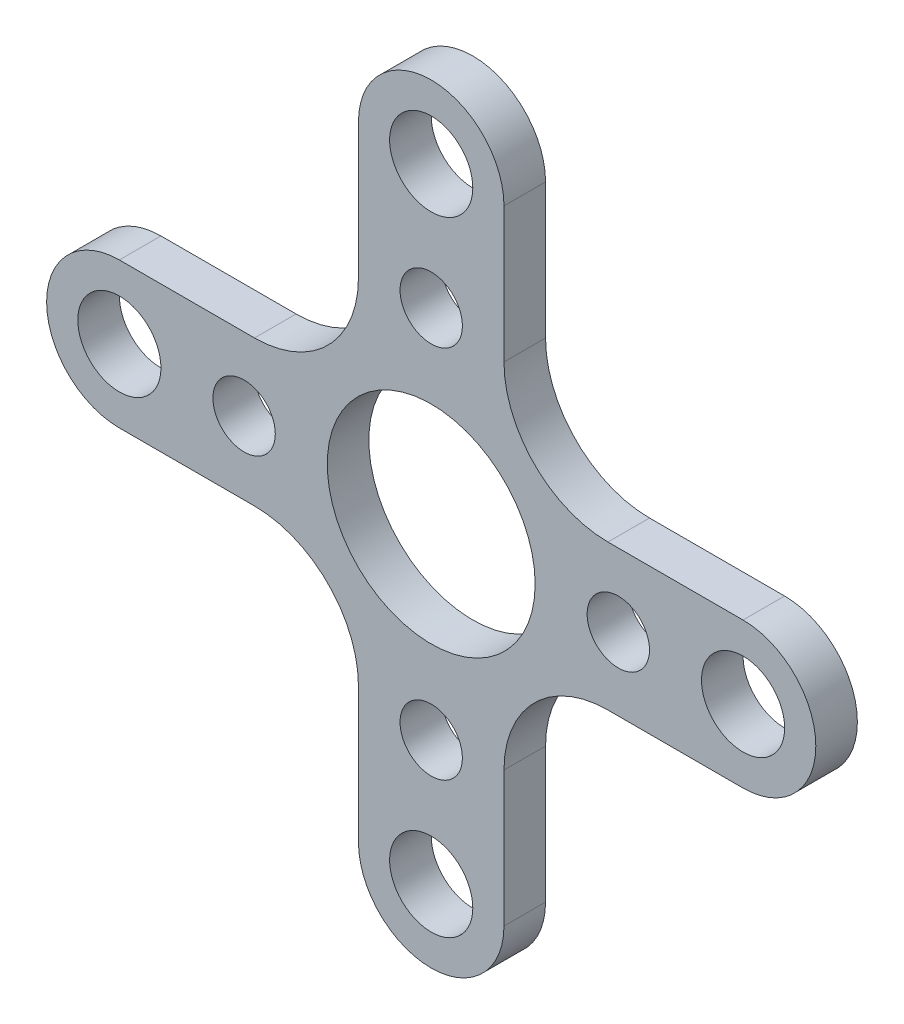
ISO-10303-21;
HEADER;
FILE_DESCRIPTION(('STEP AP214'),'2;1');
FILE_NAME('part.step','',(''),(''),'','','');
FILE_SCHEMA(('AUTOMOTIVE_DESIGN { 1 0 10303 214 1 1 1 1 }'));
ENDSEC;
DATA;
#1=APPLICATION_CONTEXT('core data for automotive mechanical design processes');
#2=APPLICATION_PROTOCOL_DEFINITION('international standard','automotive_design',2000,#1);
#3=PRODUCT_CONTEXT('',#1,'mechanical');
#4=PRODUCT('Part','Part','',(#3));
#5=PRODUCT_RELATED_PRODUCT_CATEGORY('part','',(#4));
#6=PRODUCT_DEFINITION_FORMATION('','',#4);
#7=PRODUCT_DEFINITION_CONTEXT('part definition',#1,'design');
#8=PRODUCT_DEFINITION('design','',#6,#7);
#9=PRODUCT_DEFINITION_SHAPE('','',#8);
#10=(LENGTH_UNIT() NAMED_UNIT(*) SI_UNIT(.MILLI.,.METRE.));
#11=(NAMED_UNIT(*) PLANE_ANGLE_UNIT() SI_UNIT($,.RADIAN.));
#12=(NAMED_UNIT(*) SI_UNIT($,.STERADIAN.) SOLID_ANGLE_UNIT());
#13=UNCERTAINTY_MEASURE_WITH_UNIT(LENGTH_MEASURE(1.E-05),#10,'distance_accuracy_value','');
#14=(GEOMETRIC_REPRESENTATION_CONTEXT(3) GLOBAL_UNCERTAINTY_ASSIGNED_CONTEXT((#13)) GLOBAL_UNIT_ASSIGNED_CONTEXT((#10,
#11,#12)) REPRESENTATION_CONTEXT('',''));
#15=CARTESIAN_POINT('',(0.,0.,0.));
#16=DIRECTION('',(0.,0.,1.));
#17=DIRECTION('',(1.,0.,0.));
#18=AXIS2_PLACEMENT_3D('',#15,#16,#17);
#19=CARTESIAN_POINT('',(29.9999999999999,10.5000000000001,2.));
#20=DIRECTION('',(0.,0.,-1.));
#21=DIRECTION('',(-1.,0.,0.));
#22=AXIS2_PLACEMENT_3D('',#19,#20,#21);
#23=PLANE('',#22);
#24=CARTESIAN_POINT('',(21.4999999999999,-6.99999999999996,2.));
#25=DIRECTION('',(0.,0.,1.));
#26=DIRECTION('',(1.,0.,0.));
#27=AXIS2_PLACEMENT_3D('',#24,#25,#26);
#28=CIRCLE('',#27,1.5);
#29=CARTESIAN_POINT('',(22.9999999999999,-6.99999999999996,2.));
#30=VERTEX_POINT('',#29);
#31=EDGE_CURVE('E364',#30,#30,#28,.T.);
#32=ORIENTED_EDGE('',*,*,#31,.F.);
#33=EDGE_LOOP('',(#32));
#34=FACE_BOUND('',#33,.T.);
#35=CARTESIAN_POINT('',(30.5,1.99999999999995,2.));
#36=DIRECTION('',(0.,0.,1.));
#37=DIRECTION('',(1.,0.,0.));
#38=AXIS2_PLACEMENT_3D('',#35,#36,#37);
#39=CIRCLE('',#38,1.5);
#40=CARTESIAN_POINT('',(32.,1.99999999999995,2.));
#41=VERTEX_POINT('',#40);
#42=EDGE_CURVE('E376',#41,#41,#39,.T.);
#43=ORIENTED_EDGE('',*,*,#42,.F.);
#44=EDGE_LOOP('',(#43));
#45=FACE_BOUND('',#44,.T.);
#46=CARTESIAN_POINT('',(21.5,11.,2.));
#47=DIRECTION('',(0.,0.,1.));
#48=DIRECTION('',(1.,0.,0.));
#49=AXIS2_PLACEMENT_3D('',#46,#47,#48);
#50=CIRCLE('',#49,1.5);
#51=CARTESIAN_POINT('',(23.,11.,2.));
#52=VERTEX_POINT('',#51);
#53=EDGE_CURVE('E388',#52,#52,#50,.T.);
#54=ORIENTED_EDGE('',*,*,#53,.F.);
#55=EDGE_LOOP('',(#54));
#56=FACE_BOUND('',#55,.T.);
#57=CARTESIAN_POINT('',(12.5,2.00000000000012,2.));
#58=DIRECTION('',(0.,0.,1.));
#59=DIRECTION('',(1.,0.,0.));
#60=AXIS2_PLACEMENT_3D('',#57,#58,#59);
#61=CIRCLE('',#60,1.5);
#62=CARTESIAN_POINT('',(14.,2.00000000000012,2.));
#63=VERTEX_POINT('',#62);
#64=EDGE_CURVE('E400',#63,#63,#61,.T.);
#65=ORIENTED_EDGE('',*,*,#64,.F.);
#66=EDGE_LOOP('',(#65));
#67=FACE_BOUND('',#66,.T.);
#68=CARTESIAN_POINT('',(29.9999999999999,10.5000000000001,2.));
#69=DIRECTION('',(0.,0.,-1.));
#70=DIRECTION('',(-1.,0.,0.));
#71=AXIS2_PLACEMENT_3D('',#68,#69,#70);
#72=CIRCLE('',#71,5.);
#73=CARTESIAN_POINT('',(29.9999999999999,5.50000000000011,2.));
#74=VERTEX_POINT('',#73);
#75=CARTESIAN_POINT('',(24.9999999999999,10.5000000000001,2.));
#76=VERTEX_POINT('',#75);
#77=EDGE_CURVE('E209',#74,#76,#72,.T.);
#78=ORIENTED_EDGE('',*,*,#77,.T.);
#79=DIRECTION('',(0.,1.,0.));
#80=VECTOR('',#79,1.);
#81=CARTESIAN_POINT('',(24.9999999999999,17.,2.));
#82=LINE('',#81,#80);
#83=CARTESIAN_POINT('',(24.9999999999999,17.,2.));
#84=VERTEX_POINT('',#83);
#85=EDGE_CURVE('E117',#76,#84,#82,.T.);
#86=ORIENTED_EDGE('',*,*,#85,.T.);
#87=CARTESIAN_POINT('',(21.4999999999999,17.,2.));
#88=DIRECTION('',(0.,0.,1.));
#89=DIRECTION('',(-1.,0.,0.));
#90=AXIS2_PLACEMENT_3D('',#87,#88,#89);
#91=CIRCLE('',#90,3.5);
#92=CARTESIAN_POINT('',(17.9999999999999,17.,2.));
#93=VERTEX_POINT('',#92);
#94=EDGE_CURVE('E248',#84,#93,#91,.T.);
#95=ORIENTED_EDGE('',*,*,#94,.T.);
#96=DIRECTION('',(0.,-1.,0.));
#97=VECTOR('',#96,1.);
#98=CARTESIAN_POINT('',(17.9999999999999,17.,2.));
#99=LINE('',#98,#97);
#100=CARTESIAN_POINT('',(17.9999999999999,10.5000000000001,2.));
#101=VERTEX_POINT('',#100);
#102=EDGE_CURVE('E267',#93,#101,#99,.T.);
#103=ORIENTED_EDGE('',*,*,#102,.T.);
#104=CARTESIAN_POINT('',(12.9999999999999,10.5000000000001,2.));
#105=DIRECTION('',(0.,0.,-1.));
#106=DIRECTION('',(-1.,0.,0.));
#107=AXIS2_PLACEMENT_3D('',#104,#105,#106);
#108=CIRCLE('',#107,5.);
#109=CARTESIAN_POINT('',(12.9999999999999,5.50000000000011,2.));
#110=VERTEX_POINT('',#109);
#111=EDGE_CURVE('E264',#101,#110,#108,.T.);
#112=ORIENTED_EDGE('',*,*,#111,.T.);
#113=DIRECTION('',(-1.,0.,0.));
#114=VECTOR('',#113,1.);
#115=CARTESIAN_POINT('',(6.49999999999996,5.50000000000011,2.));
#116=LINE('',#115,#114);
#117=CARTESIAN_POINT('',(6.49999999999996,5.50000000000011,2.));
#118=VERTEX_POINT('',#117);
#119=EDGE_CURVE('E266',#110,#118,#116,.T.);
#120=ORIENTED_EDGE('',*,*,#119,.T.);
#121=CARTESIAN_POINT('',(6.49999999999996,2.00000000000011,2.));
#122=DIRECTION('',(0.,0.,1.));
#123=DIRECTION('',(-1.,0.,0.));
#124=AXIS2_PLACEMENT_3D('',#121,#122,#123);
#125=CIRCLE('',#124,3.5);
#126=CARTESIAN_POINT('',(6.49999999999996,-1.49999999999989,2.));
#127=VERTEX_POINT('',#126);
#128=EDGE_CURVE('E269',#118,#127,#125,.T.);
#129=ORIENTED_EDGE('',*,*,#128,.T.);
#130=DIRECTION('',(1.,0.,0.));
#131=VECTOR('',#130,1.);
#132=CARTESIAN_POINT('',(6.49999999999996,-1.49999999999989,2.));
#133=LINE('',#132,#131);
#134=CARTESIAN_POINT('',(12.9999999999999,-1.49999999999989,2.));
#135=VERTEX_POINT('',#134);
#136=EDGE_CURVE('E275',#127,#135,#133,.T.);
#137=ORIENTED_EDGE('',*,*,#136,.T.);
#138=CARTESIAN_POINT('',(12.9999999999999,-6.49999999999989,2.));
#139=DIRECTION('',(0.,0.,-1.));
#140=DIRECTION('',(1.,0.,0.));
#141=AXIS2_PLACEMENT_3D('',#138,#139,#140);
#142=CIRCLE('',#141,5.);
#143=CARTESIAN_POINT('',(17.9999999999999,-6.49999999999989,2.));
#144=VERTEX_POINT('',#143);
#145=EDGE_CURVE('E277',#135,#144,#142,.T.);
#146=ORIENTED_EDGE('',*,*,#145,.T.);
#147=DIRECTION('',(0.,-1.,0.));
#148=VECTOR('',#147,1.);
#149=CARTESIAN_POINT('',(17.9999999999999,-6.49999999999989,2.));
#150=LINE('',#149,#148);
#151=CARTESIAN_POINT('',(17.9999999999999,-12.9999999999998,2.));
#152=VERTEX_POINT('',#151);
#153=EDGE_CURVE('E279',#144,#152,#150,.T.);
#154=ORIENTED_EDGE('',*,*,#153,.T.);
#155=CARTESIAN_POINT('',(21.4999999999999,-12.9999999999998,2.));
#156=DIRECTION('',(0.,0.,1.));
#157=DIRECTION('',(-1.,0.,0.));
#158=AXIS2_PLACEMENT_3D('',#155,#156,#157);
#159=CIRCLE('',#158,3.5);
#160=CARTESIAN_POINT('',(24.9999999999999,-12.9999999999998,2.));
#161=VERTEX_POINT('',#160);
#162=EDGE_CURVE('E281',#152,#161,#159,.T.);
#163=ORIENTED_EDGE('',*,*,#162,.T.);
#164=DIRECTION('',(0.,1.,0.));
#165=VECTOR('',#164,1.);
#166=CARTESIAN_POINT('',(24.9999999999999,-6.49999999999989,2.));
#167=LINE('',#166,#165);
#168=CARTESIAN_POINT('',(24.9999999999999,-6.49999999999989,2.));
#169=VERTEX_POINT('',#168);
#170=EDGE_CURVE('E283',#161,#169,#167,.T.);
#171=ORIENTED_EDGE('',*,*,#170,.T.);
#172=CARTESIAN_POINT('',(29.9999999999999,-6.49999999999989,2.));
#173=DIRECTION('',(0.,0.,-1.));
#174=DIRECTION('',(-1.,0.,0.));
#175=AXIS2_PLACEMENT_3D('',#172,#173,#174);
#176=CIRCLE('',#175,5.);
#177=CARTESIAN_POINT('',(29.9999999999999,-1.49999999999989,2.));
#178=VERTEX_POINT('',#177);
#179=EDGE_CURVE('E160',#169,#178,#176,.T.);
#180=ORIENTED_EDGE('',*,*,#179,.T.);
#181=DIRECTION('',(1.,0.,0.));
#182=VECTOR('',#181,1.);
#183=CARTESIAN_POINT('',(29.9999999999999,-1.49999999999989,2.));
#184=LINE('',#183,#182);
#185=CARTESIAN_POINT('',(36.4999999999998,-1.49999999999988,2.));
#186=VERTEX_POINT('',#185);
#187=EDGE_CURVE('E154',#178,#186,#184,.T.);
#188=ORIENTED_EDGE('',*,*,#187,.T.);
#189=CARTESIAN_POINT('',(36.4999999999998,2.00000000000012,2.));
#190=DIRECTION('',(0.,0.,1.));
#191=DIRECTION('',(-1.,0.,0.));
#192=AXIS2_PLACEMENT_3D('',#189,#190,#191);
#193=CIRCLE('',#192,3.5);
#194=CARTESIAN_POINT('',(36.4999999999998,5.50000000000011,2.));
#195=VERTEX_POINT('',#194);
#196=EDGE_CURVE('E158',#186,#195,#193,.T.);
#197=ORIENTED_EDGE('',*,*,#196,.T.);
#198=DIRECTION('',(-1.,0.,0.));
#199=VECTOR('',#198,1.);
#200=CARTESIAN_POINT('',(29.9999999999999,5.50000000000011,2.));
#201=LINE('',#200,#199);
#202=EDGE_CURVE('E50',#195,#74,#201,.T.);
#203=ORIENTED_EDGE('',*,*,#202,.T.);
#204=EDGE_LOOP('',(#78,#86,#95,#103,#112,#120,#129,#137,#146,#154,#163,#171,#180,#188,#197,#203));
#205=FACE_BOUND('',#204,.T.);
#206=CARTESIAN_POINT('',(21.4999999999999,2.00000000000011,2.));
#207=DIRECTION('',(0.,0.,1.));
#208=DIRECTION('',(1.,0.,0.));
#209=AXIS2_PLACEMENT_3D('',#206,#207,#208);
#210=CIRCLE('',#209,5.);
#211=CARTESIAN_POINT('',(26.4999999999999,2.00000000000011,2.));
#212=VERTEX_POINT('',#211);
#213=EDGE_CURVE('E182',#212,#212,#210,.T.);
#214=ORIENTED_EDGE('',*,*,#213,.F.);
#215=EDGE_LOOP('',(#214));
#216=FACE_BOUND('',#215,.T.);
#217=CARTESIAN_POINT('',(6.49999999999996,2.00000000000011,2.));
#218=DIRECTION('',(0.,0.,1.));
#219=DIRECTION('',(1.,0.,0.));
#220=AXIS2_PLACEMENT_3D('',#217,#218,#219);
#221=CIRCLE('',#220,2.);
#222=CARTESIAN_POINT('',(8.49999999999996,2.00000000000011,2.));
#223=VERTEX_POINT('',#222);
#224=EDGE_CURVE('E394',#223,#223,#221,.T.);
#225=ORIENTED_EDGE('',*,*,#224,.F.);
#226=EDGE_LOOP('',(#225));
#227=FACE_BOUND('',#226,.T.);
#228=CARTESIAN_POINT('',(21.5,17.,2.));
#229=DIRECTION('',(0.,0.,1.));
#230=DIRECTION('',(1.,0.,0.));
#231=AXIS2_PLACEMENT_3D('',#228,#229,#230);
#232=CIRCLE('',#231,2.);
#233=CARTESIAN_POINT('',(23.5,17.,2.));
#234=VERTEX_POINT('',#233);
#235=EDGE_CURVE('E382',#234,#234,#232,.T.);
#236=ORIENTED_EDGE('',*,*,#235,.F.);
#237=EDGE_LOOP('',(#236));
#238=FACE_BOUND('',#237,.T.);
#239=CARTESIAN_POINT('',(36.5,1.99999999999996,2.));
#240=DIRECTION('',(0.,0.,1.));
#241=DIRECTION('',(1.,0.,0.));
#242=AXIS2_PLACEMENT_3D('',#239,#240,#241);
#243=CIRCLE('',#242,2.);
#244=CARTESIAN_POINT('',(38.5,1.99999999999996,2.));
#245=VERTEX_POINT('',#244);
#246=EDGE_CURVE('E370',#245,#245,#243,.T.);
#247=ORIENTED_EDGE('',*,*,#246,.F.);
#248=EDGE_LOOP('',(#247));
#249=FACE_BOUND('',#248,.T.);
#250=CARTESIAN_POINT('',(21.4999999999999,-13.,2.));
#251=DIRECTION('',(0.,0.,1.));
#252=DIRECTION('',(1.,0.,0.));
#253=AXIS2_PLACEMENT_3D('',#250,#251,#252);
#254=CIRCLE('',#253,2.);
#255=CARTESIAN_POINT('',(23.4999999999999,-13.,2.));
#256=VERTEX_POINT('',#255);
#257=EDGE_CURVE('E355',#256,#256,#254,.T.);
#258=ORIENTED_EDGE('',*,*,#257,.F.);
#259=EDGE_LOOP('',(#258));
#260=FACE_BOUND('',#259,.T.);
#261=ADVANCED_FACE('F33',(#34,#45,#56,#67,#205,#216,#227,#238,#249,#260),#23,.F.);
#262=CARTESIAN_POINT('',(29.9999999999999,10.5000000000001,0.));
#263=DIRECTION('',(0.,0.,-1.));
#264=DIRECTION('',(-1.,0.,0.));
#265=AXIS2_PLACEMENT_3D('',#262,#263,#264);
#266=PLANE('',#265);
#267=CARTESIAN_POINT('',(21.4999999999999,-6.99999999999996,0.));
#268=DIRECTION('',(0.,0.,1.));
#269=DIRECTION('',(1.,0.,0.));
#270=AXIS2_PLACEMENT_3D('',#267,#268,#269);
#271=CIRCLE('',#270,1.5);
#272=CARTESIAN_POINT('',(22.9999999999999,-6.99999999999996,0.));
#273=VERTEX_POINT('',#272);
#274=EDGE_CURVE('E361',#273,#273,#271,.T.);
#275=ORIENTED_EDGE('',*,*,#274,.T.);
#276=EDGE_LOOP('',(#275));
#277=FACE_BOUND('',#276,.T.);
#278=CARTESIAN_POINT('',(30.5,1.99999999999995,0.));
#279=DIRECTION('',(0.,0.,1.));
#280=DIRECTION('',(1.,0.,0.));
#281=AXIS2_PLACEMENT_3D('',#278,#279,#280);
#282=CIRCLE('',#281,1.5);
#283=CARTESIAN_POINT('',(32.,1.99999999999995,0.));
#284=VERTEX_POINT('',#283);
#285=EDGE_CURVE('E373',#284,#284,#282,.T.);
#286=ORIENTED_EDGE('',*,*,#285,.T.);
#287=EDGE_LOOP('',(#286));
#288=FACE_BOUND('',#287,.T.);
#289=CARTESIAN_POINT('',(21.5,11.,0.));
#290=DIRECTION('',(0.,0.,1.));
#291=DIRECTION('',(1.,0.,0.));
#292=AXIS2_PLACEMENT_3D('',#289,#290,#291);
#293=CIRCLE('',#292,1.5);
#294=CARTESIAN_POINT('',(23.,11.,0.));
#295=VERTEX_POINT('',#294);
#296=EDGE_CURVE('E385',#295,#295,#293,.T.);
#297=ORIENTED_EDGE('',*,*,#296,.T.);
#298=EDGE_LOOP('',(#297));
#299=FACE_BOUND('',#298,.T.);
#300=CARTESIAN_POINT('',(12.5,2.00000000000012,0.));
#301=DIRECTION('',(0.,0.,1.));
#302=DIRECTION('',(1.,0.,0.));
#303=AXIS2_PLACEMENT_3D('',#300,#301,#302);
#304=CIRCLE('',#303,1.5);
#305=CARTESIAN_POINT('',(14.,2.00000000000012,0.));
#306=VERTEX_POINT('',#305);
#307=EDGE_CURVE('E397',#306,#306,#304,.T.);
#308=ORIENTED_EDGE('',*,*,#307,.T.);
#309=EDGE_LOOP('',(#308));
#310=FACE_BOUND('',#309,.T.);
#311=CARTESIAN_POINT('',(29.9999999999999,10.5000000000001,0.));
#312=DIRECTION('',(0.,0.,-1.));
#313=DIRECTION('',(-1.,0.,0.));
#314=AXIS2_PLACEMENT_3D('',#311,#312,#313);
#315=CIRCLE('',#314,5.);
#316=CARTESIAN_POINT('',(29.9999999999999,5.50000000000011,0.));
#317=VERTEX_POINT('',#316);
#318=CARTESIAN_POINT('',(24.9999999999999,10.5000000000001,0.));
#319=VERTEX_POINT('',#318);
#320=EDGE_CURVE('E178',#317,#319,#315,.T.);
#321=ORIENTED_EDGE('',*,*,#320,.F.);
#322=DIRECTION('',(-1.,0.,0.));
#323=VECTOR('',#322,1.);
#324=CARTESIAN_POINT('',(29.9999999999999,5.50000000000011,0.));
#325=LINE('',#324,#323);
#326=CARTESIAN_POINT('',(36.4999999999998,5.50000000000011,0.));
#327=VERTEX_POINT('',#326);
#328=EDGE_CURVE('E109',#327,#317,#325,.T.);
#329=ORIENTED_EDGE('',*,*,#328,.F.);
#330=CARTESIAN_POINT('',(36.4999999999998,2.00000000000012,0.));
#331=DIRECTION('',(0.,0.,1.));
#332=DIRECTION('',(-1.,0.,0.));
#333=AXIS2_PLACEMENT_3D('',#330,#331,#332);
#334=CIRCLE('',#333,3.5);
#335=CARTESIAN_POINT('',(36.4999999999998,-1.49999999999988,0.));
#336=VERTEX_POINT('',#335);
#337=EDGE_CURVE('E103',#336,#327,#334,.T.);
#338=ORIENTED_EDGE('',*,*,#337,.F.);
#339=DIRECTION('',(1.,0.,0.));
#340=VECTOR('',#339,1.);
#341=CARTESIAN_POINT('',(29.9999999999999,-1.49999999999989,0.));
#342=LINE('',#341,#340);
#343=CARTESIAN_POINT('',(29.9999999999999,-1.49999999999989,0.));
#344=VERTEX_POINT('',#343);
#345=EDGE_CURVE('E168',#344,#336,#342,.T.);
#346=ORIENTED_EDGE('',*,*,#345,.F.);
#347=CARTESIAN_POINT('',(29.9999999999999,-6.49999999999989,0.));
#348=DIRECTION('',(0.,0.,-1.));
#349=DIRECTION('',(-1.,0.,0.));
#350=AXIS2_PLACEMENT_3D('',#347,#348,#349);
#351=CIRCLE('',#350,5.);
#352=CARTESIAN_POINT('',(24.9999999999999,-6.49999999999989,0.));
#353=VERTEX_POINT('',#352);
#354=EDGE_CURVE('E204',#353,#344,#351,.T.);
#355=ORIENTED_EDGE('',*,*,#354,.F.);
#356=DIRECTION('',(0.,1.,0.));
#357=VECTOR('',#356,1.);
#358=CARTESIAN_POINT('',(24.9999999999999,-6.49999999999989,0.));
#359=LINE('',#358,#357);
#360=CARTESIAN_POINT('',(24.9999999999999,-12.9999999999998,0.));
#361=VERTEX_POINT('',#360);
#362=EDGE_CURVE('E202',#361,#353,#359,.T.);
#363=ORIENTED_EDGE('',*,*,#362,.F.);
#364=CARTESIAN_POINT('',(21.4999999999999,-12.9999999999998,0.));
#365=DIRECTION('',(0.,0.,1.));
#366=DIRECTION('',(-1.,0.,0.));
#367=AXIS2_PLACEMENT_3D('',#364,#365,#366);
#368=CIRCLE('',#367,3.5);
#369=CARTESIAN_POINT('',(17.9999999999999,-12.9999999999998,0.));
#370=VERTEX_POINT('',#369);
#371=EDGE_CURVE('E200',#370,#361,#368,.T.);
#372=ORIENTED_EDGE('',*,*,#371,.F.);
#373=DIRECTION('',(0.,-1.,0.));
#374=VECTOR('',#373,1.);
#375=CARTESIAN_POINT('',(17.9999999999999,-6.49999999999989,0.));
#376=LINE('',#375,#374);
#377=CARTESIAN_POINT('',(17.9999999999999,-6.49999999999989,0.));
#378=VERTEX_POINT('',#377);
#379=EDGE_CURVE('E198',#378,#370,#376,.T.);
#380=ORIENTED_EDGE('',*,*,#379,.F.);
#381=CARTESIAN_POINT('',(12.9999999999999,-6.49999999999989,0.));
#382=DIRECTION('',(0.,0.,-1.));
#383=DIRECTION('',(1.,0.,0.));
#384=AXIS2_PLACEMENT_3D('',#381,#382,#383);
#385=CIRCLE('',#384,5.);
#386=CARTESIAN_POINT('',(12.9999999999999,-1.49999999999989,0.));
#387=VERTEX_POINT('',#386);
#388=EDGE_CURVE('E196',#387,#378,#385,.T.);
#389=ORIENTED_EDGE('',*,*,#388,.F.);
#390=DIRECTION('',(1.,0.,0.));
#391=VECTOR('',#390,1.);
#392=CARTESIAN_POINT('',(6.49999999999996,-1.49999999999989,0.));
#393=LINE('',#392,#391);
#394=CARTESIAN_POINT('',(6.49999999999996,-1.49999999999989,0.));
#395=VERTEX_POINT('',#394);
#396=EDGE_CURVE('E194',#395,#387,#393,.T.);
#397=ORIENTED_EDGE('',*,*,#396,.F.);
#398=CARTESIAN_POINT('',(6.49999999999996,2.00000000000011,0.));
#399=DIRECTION('',(0.,0.,1.));
#400=DIRECTION('',(-1.,0.,0.));
#401=AXIS2_PLACEMENT_3D('',#398,#399,#400);
#402=CIRCLE('',#401,3.5);
#403=CARTESIAN_POINT('',(6.49999999999996,5.50000000000011,0.));
#404=VERTEX_POINT('',#403);
#405=EDGE_CURVE('E192',#404,#395,#402,.T.);
#406=ORIENTED_EDGE('',*,*,#405,.F.);
#407=DIRECTION('',(-1.,0.,0.));
#408=VECTOR('',#407,1.);
#409=CARTESIAN_POINT('',(6.49999999999996,5.50000000000011,0.));
#410=LINE('',#409,#408);
#411=CARTESIAN_POINT('',(12.9999999999999,5.50000000000011,0.));
#412=VERTEX_POINT('',#411);
#413=EDGE_CURVE('E190',#412,#404,#410,.T.);
#414=ORIENTED_EDGE('',*,*,#413,.F.);
#415=CARTESIAN_POINT('',(12.9999999999999,10.5000000000001,0.));
#416=DIRECTION('',(0.,0.,-1.));
#417=DIRECTION('',(-1.,0.,0.));
#418=AXIS2_PLACEMENT_3D('',#415,#416,#417);
#419=CIRCLE('',#418,5.);
#420=CARTESIAN_POINT('',(17.9999999999999,10.5000000000001,0.));
#421=VERTEX_POINT('',#420);
#422=EDGE_CURVE('E188',#421,#412,#419,.T.);
#423=ORIENTED_EDGE('',*,*,#422,.F.);
#424=DIRECTION('',(0.,-1.,0.));
#425=VECTOR('',#424,1.);
#426=CARTESIAN_POINT('',(17.9999999999999,17.,0.));
#427=LINE('',#426,#425);
#428=CARTESIAN_POINT('',(17.9999999999999,17.,0.));
#429=VERTEX_POINT('',#428);
#430=EDGE_CURVE('E186',#429,#421,#427,.T.);
#431=ORIENTED_EDGE('',*,*,#430,.F.);
#432=CARTESIAN_POINT('',(21.4999999999999,17.,0.));
#433=DIRECTION('',(0.,0.,1.));
#434=DIRECTION('',(-1.,0.,0.));
#435=AXIS2_PLACEMENT_3D('',#432,#433,#434);
#436=CIRCLE('',#435,3.5);
#437=CARTESIAN_POINT('',(24.9999999999999,17.,0.));
#438=VERTEX_POINT('',#437);
#439=EDGE_CURVE('E184',#438,#429,#436,.T.);
#440=ORIENTED_EDGE('',*,*,#439,.F.);
#441=DIRECTION('',(0.,1.,0.));
#442=VECTOR('',#441,1.);
#443=CARTESIAN_POINT('',(24.9999999999999,17.,0.));
#444=LINE('',#443,#442);
#445=EDGE_CURVE('E181',#319,#438,#444,.T.);
#446=ORIENTED_EDGE('',*,*,#445,.F.);
#447=EDGE_LOOP('',(#321,#329,#338,#346,#355,#363,#372,#380,#389,#397,#406,#414,#423,#431,#440,#446));
#448=FACE_BOUND('',#447,.T.);
#449=CARTESIAN_POINT('',(21.4999999999999,2.00000000000011,0.));
#450=DIRECTION('',(0.,0.,1.));
#451=DIRECTION('',(1.,0.,0.));
#452=AXIS2_PLACEMENT_3D('',#449,#450,#451);
#453=CIRCLE('',#452,5.);
#454=CARTESIAN_POINT('',(26.4999999999999,2.00000000000011,0.));
#455=VERTEX_POINT('',#454);
#456=EDGE_CURVE('E403',#455,#455,#453,.T.);
#457=ORIENTED_EDGE('',*,*,#456,.T.);
#458=EDGE_LOOP('',(#457));
#459=FACE_BOUND('',#458,.T.);
#460=CARTESIAN_POINT('',(6.49999999999996,2.00000000000011,0.));
#461=DIRECTION('',(0.,0.,1.));
#462=DIRECTION('',(1.,0.,0.));
#463=AXIS2_PLACEMENT_3D('',#460,#461,#462);
#464=CIRCLE('',#463,2.);
#465=CARTESIAN_POINT('',(8.49999999999996,2.00000000000011,0.));
#466=VERTEX_POINT('',#465);
#467=EDGE_CURVE('E391',#466,#466,#464,.T.);
#468=ORIENTED_EDGE('',*,*,#467,.T.);
#469=EDGE_LOOP('',(#468));
#470=FACE_BOUND('',#469,.T.);
#471=CARTESIAN_POINT('',(21.5,17.,0.));
#472=DIRECTION('',(0.,0.,1.));
#473=DIRECTION('',(1.,0.,0.));
#474=AXIS2_PLACEMENT_3D('',#471,#472,#473);
#475=CIRCLE('',#474,2.);
#476=CARTESIAN_POINT('',(23.5,17.,0.));
#477=VERTEX_POINT('',#476);
#478=EDGE_CURVE('E379',#477,#477,#475,.T.);
#479=ORIENTED_EDGE('',*,*,#478,.T.);
#480=EDGE_LOOP('',(#479));
#481=FACE_BOUND('',#480,.T.);
#482=CARTESIAN_POINT('',(36.5,1.99999999999996,0.));
#483=DIRECTION('',(0.,0.,1.));
#484=DIRECTION('',(1.,0.,0.));
#485=AXIS2_PLACEMENT_3D('',#482,#483,#484);
#486=CIRCLE('',#485,2.);
#487=CARTESIAN_POINT('',(38.5,1.99999999999996,0.));
#488=VERTEX_POINT('',#487);
#489=EDGE_CURVE('E367',#488,#488,#486,.T.);
#490=ORIENTED_EDGE('',*,*,#489,.T.);
#491=EDGE_LOOP('',(#490));
#492=FACE_BOUND('',#491,.T.);
#493=CARTESIAN_POINT('',(21.4999999999999,-13.,0.));
#494=DIRECTION('',(0.,0.,1.));
#495=DIRECTION('',(1.,0.,0.));
#496=AXIS2_PLACEMENT_3D('',#493,#494,#495);
#497=CIRCLE('',#496,2.);
#498=CARTESIAN_POINT('',(23.4999999999999,-13.,0.));
#499=VERTEX_POINT('',#498);
#500=EDGE_CURVE('E358',#499,#499,#497,.T.);
#501=ORIENTED_EDGE('',*,*,#500,.T.);
#502=EDGE_LOOP('',(#501));
#503=FACE_BOUND('',#502,.T.);
#504=ADVANCED_FACE('F252',(#277,#288,#299,#310,#448,#459,#470,#481,#492,#503),#266,.T.);
#505=CARTESIAN_POINT('',(29.9999999999999,10.5000000000001,2.));
#506=DIRECTION('',(0.,0.,-1.));
#507=DIRECTION('',(-1.,0.,0.));
#508=AXIS2_PLACEMENT_3D('',#505,#506,#507);
#509=CYLINDRICAL_SURFACE('',#508,5.);
#510=ORIENTED_EDGE('',*,*,#320,.T.);
#511=DIRECTION('',(0.,0.,-1.));
#512=VECTOR('',#511,1.);
#513=CARTESIAN_POINT('',(24.9999999999999,10.5000000000001,2.));
#514=LINE('',#513,#512);
#515=EDGE_CURVE('E11',#76,#319,#514,.T.);
#516=ORIENTED_EDGE('',*,*,#515,.F.);
#517=ORIENTED_EDGE('',*,*,#77,.F.);
#518=DIRECTION('',(0.,0.,-1.));
#519=VECTOR('',#518,1.);
#520=CARTESIAN_POINT('',(29.9999999999999,5.50000000000011,2.));
#521=LINE('',#520,#519);
#522=EDGE_CURVE('E174',#74,#317,#521,.T.);
#523=ORIENTED_EDGE('',*,*,#522,.T.);
#524=EDGE_LOOP('',(#510,#516,#517,#523));
#525=FACE_BOUND('',#524,.T.);
#526=ADVANCED_FACE('F35',(#525),#509,.F.);
#527=CARTESIAN_POINT('',(24.9999999999999,17.,2.));
#528=DIRECTION('',(-1.,0.,0.));
#529=DIRECTION('',(0.,0.,1.));
#530=AXIS2_PLACEMENT_3D('',#527,#528,#529);
#531=PLANE('',#530);
#532=ORIENTED_EDGE('',*,*,#445,.T.);
#533=DIRECTION('',(0.,0.,-1.));
#534=VECTOR('',#533,1.);
#535=CARTESIAN_POINT('',(24.9999999999999,17.,2.));
#536=LINE('',#535,#534);
#537=EDGE_CURVE('E42',#84,#438,#536,.T.);
#538=ORIENTED_EDGE('',*,*,#537,.F.);
#539=ORIENTED_EDGE('',*,*,#85,.F.);
#540=ORIENTED_EDGE('',*,*,#515,.T.);
#541=EDGE_LOOP('',(#532,#538,#539,#540));
#542=FACE_BOUND('',#541,.T.);
#543=ADVANCED_FACE('F597',(#542),#531,.F.);
#544=CARTESIAN_POINT('',(21.4999999999999,17.,2.));
#545=DIRECTION('',(0.,0.,-1.));
#546=DIRECTION('',(-1.,0.,0.));
#547=AXIS2_PLACEMENT_3D('',#544,#545,#546);
#548=CYLINDRICAL_SURFACE('',#547,3.5);
#549=ORIENTED_EDGE('',*,*,#439,.T.);
#550=DIRECTION('',(0.,0.,-1.));
#551=VECTOR('',#550,1.);
#552=CARTESIAN_POINT('',(17.9999999999999,17.,2.));
#553=LINE('',#552,#551);
#554=EDGE_CURVE('E240',#93,#429,#553,.T.);
#555=ORIENTED_EDGE('',*,*,#554,.F.);
#556=ORIENTED_EDGE('',*,*,#94,.F.);
#557=ORIENTED_EDGE('',*,*,#537,.T.);
#558=EDGE_LOOP('',(#549,#555,#556,#557));
#559=FACE_BOUND('',#558,.T.);
#560=ADVANCED_FACE('F246',(#559),#548,.T.);
#561=CARTESIAN_POINT('',(17.9999999999999,17.,2.));
#562=DIRECTION('',(1.,0.,0.));
#563=DIRECTION('',(0.,1.,0.));
#564=AXIS2_PLACEMENT_3D('',#561,#562,#563);
#565=PLANE('',#564);
#566=ORIENTED_EDGE('',*,*,#430,.T.);
#567=DIRECTION('',(0.,0.,-1.));
#568=VECTOR('',#567,1.);
#569=CARTESIAN_POINT('',(17.9999999999999,10.5000000000001,2.));
#570=LINE('',#569,#568);
#571=EDGE_CURVE('E237',#101,#421,#570,.T.);
#572=ORIENTED_EDGE('',*,*,#571,.F.);
#573=ORIENTED_EDGE('',*,*,#102,.F.);
#574=ORIENTED_EDGE('',*,*,#554,.T.);
#575=EDGE_LOOP('',(#566,#572,#573,#574));
#576=FACE_BOUND('',#575,.T.);
#577=ADVANCED_FACE('F258',(#576),#565,.F.);
#578=CARTESIAN_POINT('',(12.9999999999999,10.5000000000001,2.));
#579=DIRECTION('',(0.,0.,-1.));
#580=DIRECTION('',(-1.,0.,0.));
#581=AXIS2_PLACEMENT_3D('',#578,#579,#580);
#582=CYLINDRICAL_SURFACE('',#581,5.);
#583=ORIENTED_EDGE('',*,*,#422,.T.);
#584=DIRECTION('',(0.,0.,-1.));
#585=VECTOR('',#584,1.);
#586=CARTESIAN_POINT('',(12.9999999999999,5.50000000000011,2.));
#587=LINE('',#586,#585);
#588=EDGE_CURVE('E234',#110,#412,#587,.T.);
#589=ORIENTED_EDGE('',*,*,#588,.F.);
#590=ORIENTED_EDGE('',*,*,#111,.F.);
#591=ORIENTED_EDGE('',*,*,#571,.T.);
#592=EDGE_LOOP('',(#583,#589,#590,#591));
#593=FACE_BOUND('',#592,.T.);
#594=ADVANCED_FACE('F262',(#593),#582,.F.);
#595=CARTESIAN_POINT('',(6.49999999999996,5.50000000000011,2.));
#596=DIRECTION('',(0.,-1.,0.));
#597=DIRECTION('',(1.,0.,0.));
#598=AXIS2_PLACEMENT_3D('',#595,#596,#597);
#599=PLANE('',#598);
#600=ORIENTED_EDGE('',*,*,#413,.T.);
#601=DIRECTION('',(0.,0.,-1.));
#602=VECTOR('',#601,1.);
#603=CARTESIAN_POINT('',(6.49999999999996,5.50000000000011,2.));
#604=LINE('',#603,#602);
#605=EDGE_CURVE('E231',#118,#404,#604,.T.);
#606=ORIENTED_EDGE('',*,*,#605,.F.);
#607=ORIENTED_EDGE('',*,*,#119,.F.);
#608=ORIENTED_EDGE('',*,*,#588,.T.);
#609=EDGE_LOOP('',(#600,#606,#607,#608));
#610=FACE_BOUND('',#609,.T.);
#611=ADVANCED_FACE('F562',(#610),#599,.F.);
#612=CARTESIAN_POINT('',(6.49999999999996,2.00000000000011,2.));
#613=DIRECTION('',(0.,0.,-1.));
#614=DIRECTION('',(-1.,0.,0.));
#615=AXIS2_PLACEMENT_3D('',#612,#613,#614);
#616=CYLINDRICAL_SURFACE('',#615,3.5);
#617=ORIENTED_EDGE('',*,*,#405,.T.);
#618=DIRECTION('',(0.,0.,-1.));
#619=VECTOR('',#618,1.);
#620=CARTESIAN_POINT('',(6.49999999999996,-1.49999999999989,2.));
#621=LINE('',#620,#619);
#622=EDGE_CURVE('E228',#127,#395,#621,.T.);
#623=ORIENTED_EDGE('',*,*,#622,.F.);
#624=ORIENTED_EDGE('',*,*,#128,.F.);
#625=ORIENTED_EDGE('',*,*,#605,.T.);
#626=EDGE_LOOP('',(#617,#623,#624,#625));
#627=FACE_BOUND('',#626,.T.);
#628=ADVANCED_FACE('F552',(#627),#616,.T.);
#629=CARTESIAN_POINT('',(6.49999999999996,-1.49999999999989,2.));
#630=DIRECTION('',(0.,1.,0.));
#631=DIRECTION('',(0.,0.,1.));
#632=AXIS2_PLACEMENT_3D('',#629,#630,#631);
#633=PLANE('',#632);
#634=ORIENTED_EDGE('',*,*,#396,.T.);
#635=DIRECTION('',(0.,0.,-1.));
#636=VECTOR('',#635,1.);
#637=CARTESIAN_POINT('',(12.9999999999999,-1.49999999999989,2.));
#638=LINE('',#637,#636);
#639=EDGE_CURVE('E225',#135,#387,#638,.T.);
#640=ORIENTED_EDGE('',*,*,#639,.F.);
#641=ORIENTED_EDGE('',*,*,#136,.F.);
#642=ORIENTED_EDGE('',*,*,#622,.T.);
#643=EDGE_LOOP('',(#634,#640,#641,#642));
#644=FACE_BOUND('',#643,.T.);
#645=ADVANCED_FACE('F542',(#644),#633,.F.);
#646=CARTESIAN_POINT('',(12.9999999999999,-6.49999999999989,2.));
#647=DIRECTION('',(0.,0.,-1.));
#648=DIRECTION('',(-1.,0.,0.));
#649=AXIS2_PLACEMENT_3D('',#646,#647,#648);
#650=CYLINDRICAL_SURFACE('',#649,5.);
#651=ORIENTED_EDGE('',*,*,#388,.T.);
#652=DIRECTION('',(0.,0.,-1.));
#653=VECTOR('',#652,1.);
#654=CARTESIAN_POINT('',(17.9999999999999,-6.49999999999989,2.));
#655=LINE('',#654,#653);
#656=EDGE_CURVE('E222',#144,#378,#655,.T.);
#657=ORIENTED_EDGE('',*,*,#656,.F.);
#658=ORIENTED_EDGE('',*,*,#145,.F.);
#659=ORIENTED_EDGE('',*,*,#639,.T.);
#660=EDGE_LOOP('',(#651,#657,#658,#659));
#661=FACE_BOUND('',#660,.T.);
#662=ADVANCED_FACE('F532',(#661),#650,.F.);
#663=CARTESIAN_POINT('',(17.9999999999999,-6.49999999999989,2.));
#664=DIRECTION('',(1.,0.,0.));
#665=DIRECTION('',(0.,0.,-1.));
#666=AXIS2_PLACEMENT_3D('',#663,#664,#665);
#667=PLANE('',#666);
#668=ORIENTED_EDGE('',*,*,#379,.T.);
#669=DIRECTION('',(0.,0.,-1.));
#670=VECTOR('',#669,1.);
#671=CARTESIAN_POINT('',(17.9999999999999,-12.9999999999998,2.));
#672=LINE('',#671,#670);
#673=EDGE_CURVE('E219',#152,#370,#672,.T.);
#674=ORIENTED_EDGE('',*,*,#673,.F.);
#675=ORIENTED_EDGE('',*,*,#153,.F.);
#676=ORIENTED_EDGE('',*,*,#656,.T.);
#677=EDGE_LOOP('',(#668,#674,#675,#676));
#678=FACE_BOUND('',#677,.T.);
#679=ADVANCED_FACE('F522',(#678),#667,.F.);
#680=CARTESIAN_POINT('',(21.4999999999999,-12.9999999999998,2.));
#681=DIRECTION('',(0.,0.,-1.));
#682=DIRECTION('',(-1.,0.,0.));
#683=AXIS2_PLACEMENT_3D('',#680,#681,#682);
#684=CYLINDRICAL_SURFACE('',#683,3.5);
#685=ORIENTED_EDGE('',*,*,#371,.T.);
#686=DIRECTION('',(0.,0.,-1.));
#687=VECTOR('',#686,1.);
#688=CARTESIAN_POINT('',(24.9999999999999,-12.9999999999998,2.));
#689=LINE('',#688,#687);
#690=EDGE_CURVE('E216',#161,#361,#689,.T.);
#691=ORIENTED_EDGE('',*,*,#690,.F.);
#692=ORIENTED_EDGE('',*,*,#162,.F.);
#693=ORIENTED_EDGE('',*,*,#673,.T.);
#694=EDGE_LOOP('',(#685,#691,#692,#693));
#695=FACE_BOUND('',#694,.T.);
#696=ADVANCED_FACE('F513',(#695),#684,.T.);
#697=CARTESIAN_POINT('',(24.9999999999999,-6.49999999999989,2.));
#698=DIRECTION('',(-1.,0.,0.));
#699=DIRECTION('',(0.,-1.,0.));
#700=AXIS2_PLACEMENT_3D('',#697,#698,#699);
#701=PLANE('',#700);
#702=ORIENTED_EDGE('',*,*,#362,.T.);
#703=DIRECTION('',(0.,0.,-1.));
#704=VECTOR('',#703,1.);
#705=CARTESIAN_POINT('',(24.9999999999999,-6.49999999999989,2.));
#706=LINE('',#705,#704);
#707=EDGE_CURVE('E213',#169,#353,#706,.T.);
#708=ORIENTED_EDGE('',*,*,#707,.F.);
#709=ORIENTED_EDGE('',*,*,#170,.F.);
#710=ORIENTED_EDGE('',*,*,#690,.T.);
#711=EDGE_LOOP('',(#702,#708,#709,#710));
#712=FACE_BOUND('',#711,.T.);
#713=ADVANCED_FACE('F289',(#712),#701,.F.);
#714=CARTESIAN_POINT('',(29.9999999999999,-6.49999999999989,2.));
#715=DIRECTION('',(0.,0.,-1.));
#716=DIRECTION('',(-1.,0.,0.));
#717=AXIS2_PLACEMENT_3D('',#714,#715,#716);
#718=CYLINDRICAL_SURFACE('',#717,5.);
#719=ORIENTED_EDGE('',*,*,#354,.T.);
#720=DIRECTION('',(0.,0.,-1.));
#721=VECTOR('',#720,1.);
#722=CARTESIAN_POINT('',(29.9999999999999,-1.49999999999989,2.));
#723=LINE('',#722,#721);
#724=EDGE_CURVE('E169',#178,#344,#723,.T.);
#725=ORIENTED_EDGE('',*,*,#724,.F.);
#726=ORIENTED_EDGE('',*,*,#179,.F.);
#727=ORIENTED_EDGE('',*,*,#707,.T.);
#728=EDGE_LOOP('',(#719,#725,#726,#727));
#729=FACE_BOUND('',#728,.T.);
#730=ADVANCED_FACE('F293',(#729),#718,.F.);
#731=CARTESIAN_POINT('',(29.9999999999999,-1.49999999999989,2.));
#732=DIRECTION('',(0.,1.,0.));
#733=DIRECTION('',(-1.,0.,0.));
#734=AXIS2_PLACEMENT_3D('',#731,#732,#733);
#735=PLANE('',#734);
#736=ORIENTED_EDGE('',*,*,#345,.T.);
#737=DIRECTION('',(0.,0.,-1.));
#738=VECTOR('',#737,1.);
#739=CARTESIAN_POINT('',(36.4999999999998,-1.49999999999988,2.));
#740=LINE('',#739,#738);
#741=EDGE_CURVE('E165',#186,#336,#740,.T.);
#742=ORIENTED_EDGE('',*,*,#741,.F.);
#743=ORIENTED_EDGE('',*,*,#187,.F.);
#744=ORIENTED_EDGE('',*,*,#724,.T.);
#745=EDGE_LOOP('',(#736,#742,#743,#744));
#746=FACE_BOUND('',#745,.T.);
#747=ADVANCED_FACE('F166',(#746),#735,.F.);
#748=CARTESIAN_POINT('',(36.4999999999998,2.00000000000012,2.));
#749=DIRECTION('',(0.,0.,-1.));
#750=DIRECTION('',(-1.,0.,0.));
#751=AXIS2_PLACEMENT_3D('',#748,#749,#750);
#752=CYLINDRICAL_SURFACE('',#751,3.5);
#753=ORIENTED_EDGE('',*,*,#337,.T.);
#754=DIRECTION('',(0.,0.,-1.));
#755=VECTOR('',#754,1.);
#756=CARTESIAN_POINT('',(36.4999999999998,5.50000000000011,2.));
#757=LINE('',#756,#755);
#758=EDGE_CURVE('E170',#195,#327,#757,.T.);
#759=ORIENTED_EDGE('',*,*,#758,.F.);
#760=ORIENTED_EDGE('',*,*,#196,.F.);
#761=ORIENTED_EDGE('',*,*,#741,.T.);
#762=EDGE_LOOP('',(#753,#759,#760,#761));
#763=FACE_BOUND('',#762,.T.);
#764=ADVANCED_FACE('F172',(#763),#752,.T.);
#765=CARTESIAN_POINT('',(29.9999999999999,5.50000000000011,2.));
#766=DIRECTION('',(0.,-1.,0.));
#767=DIRECTION('',(1.,0.,0.));
#768=AXIS2_PLACEMENT_3D('',#765,#766,#767);
#769=PLANE('',#768);
#770=ORIENTED_EDGE('',*,*,#328,.T.);
#771=ORIENTED_EDGE('',*,*,#522,.F.);
#772=ORIENTED_EDGE('',*,*,#202,.F.);
#773=ORIENTED_EDGE('',*,*,#758,.T.);
#774=EDGE_LOOP('',(#770,#771,#772,#773));
#775=FACE_BOUND('',#774,.T.);
#776=ADVANCED_FACE('F297',(#775),#769,.F.);
#777=CARTESIAN_POINT('',(21.4999999999999,2.00000000000011,2.));
#778=DIRECTION('',(0.,0.,-1.));
#779=DIRECTION('',(-1.,0.,0.));
#780=AXIS2_PLACEMENT_3D('',#777,#778,#779);
#781=CYLINDRICAL_SURFACE('',#780,5.);
#782=ORIENTED_EDGE('',*,*,#213,.T.);
#783=EDGE_LOOP('',(#782));
#784=FACE_BOUND('',#783,.T.);
#785=ORIENTED_EDGE('',*,*,#456,.F.);
#786=EDGE_LOOP('',(#785));
#787=FACE_BOUND('',#786,.T.);
#788=ADVANCED_FACE('F299',(#784,#787),#781,.F.);
#789=CARTESIAN_POINT('',(12.5,2.00000000000012,2.));
#790=DIRECTION('',(0.,0.,-1.));
#791=DIRECTION('',(-1.,0.,0.));
#792=AXIS2_PLACEMENT_3D('',#789,#790,#791);
#793=CYLINDRICAL_SURFACE('',#792,1.5);
#794=ORIENTED_EDGE('',*,*,#64,.T.);
#795=EDGE_LOOP('',(#794));
#796=FACE_BOUND('',#795,.T.);
#797=ORIENTED_EDGE('',*,*,#307,.F.);
#798=EDGE_LOOP('',(#797));
#799=FACE_BOUND('',#798,.T.);
#800=ADVANCED_FACE('F305',(#796,#799),#793,.F.);
#801=CARTESIAN_POINT('',(6.49999999999996,2.00000000000011,2.));
#802=DIRECTION('',(0.,0.,-1.));
#803=DIRECTION('',(-1.,0.,0.));
#804=AXIS2_PLACEMENT_3D('',#801,#802,#803);
#805=CYLINDRICAL_SURFACE('',#804,2.);
#806=ORIENTED_EDGE('',*,*,#224,.T.);
#807=EDGE_LOOP('',(#806));
#808=FACE_BOUND('',#807,.T.);
#809=ORIENTED_EDGE('',*,*,#467,.F.);
#810=EDGE_LOOP('',(#809));
#811=FACE_BOUND('',#810,.T.);
#812=ADVANCED_FACE('F322',(#808,#811),#805,.F.);
#813=CARTESIAN_POINT('',(21.5,11.,2.));
#814=DIRECTION('',(0.,0.,-1.));
#815=DIRECTION('',(-1.,0.,0.));
#816=AXIS2_PLACEMENT_3D('',#813,#814,#815);
#817=CYLINDRICAL_SURFACE('',#816,1.5);
#818=ORIENTED_EDGE('',*,*,#53,.T.);
#819=EDGE_LOOP('',(#818));
#820=FACE_BOUND('',#819,.T.);
#821=ORIENTED_EDGE('',*,*,#296,.F.);
#822=EDGE_LOOP('',(#821));
#823=FACE_BOUND('',#822,.T.);
#824=ADVANCED_FACE('F326',(#820,#823),#817,.F.);
#825=CARTESIAN_POINT('',(21.5,17.,2.));
#826=DIRECTION('',(0.,0.,-1.));
#827=DIRECTION('',(-1.,0.,0.));
#828=AXIS2_PLACEMENT_3D('',#825,#826,#827);
#829=CYLINDRICAL_SURFACE('',#828,2.);
#830=ORIENTED_EDGE('',*,*,#235,.T.);
#831=EDGE_LOOP('',(#830));
#832=FACE_BOUND('',#831,.T.);
#833=ORIENTED_EDGE('',*,*,#478,.F.);
#834=EDGE_LOOP('',(#833));
#835=FACE_BOUND('',#834,.T.);
#836=ADVANCED_FACE('F330',(#832,#835),#829,.F.);
#837=CARTESIAN_POINT('',(30.5,1.99999999999995,2.));
#838=DIRECTION('',(0.,0.,-1.));
#839=DIRECTION('',(-1.,0.,0.));
#840=AXIS2_PLACEMENT_3D('',#837,#838,#839);
#841=CYLINDRICAL_SURFACE('',#840,1.5);
#842=ORIENTED_EDGE('',*,*,#42,.T.);
#843=EDGE_LOOP('',(#842));
#844=FACE_BOUND('',#843,.T.);
#845=ORIENTED_EDGE('',*,*,#285,.F.);
#846=EDGE_LOOP('',(#845));
#847=FACE_BOUND('',#846,.T.);
#848=ADVANCED_FACE('F334',(#844,#847),#841,.F.);
#849=CARTESIAN_POINT('',(36.5,1.99999999999996,2.));
#850=DIRECTION('',(0.,0.,-1.));
#851=DIRECTION('',(-1.,0.,0.));
#852=AXIS2_PLACEMENT_3D('',#849,#850,#851);
#853=CYLINDRICAL_SURFACE('',#852,2.);
#854=ORIENTED_EDGE('',*,*,#246,.T.);
#855=EDGE_LOOP('',(#854));
#856=FACE_BOUND('',#855,.T.);
#857=ORIENTED_EDGE('',*,*,#489,.F.);
#858=EDGE_LOOP('',(#857));
#859=FACE_BOUND('',#858,.T.);
#860=ADVANCED_FACE('F338',(#856,#859),#853,.F.);
#861=CARTESIAN_POINT('',(21.4999999999999,-6.99999999999996,2.));
#862=DIRECTION('',(0.,0.,-1.));
#863=DIRECTION('',(-1.,0.,0.));
#864=AXIS2_PLACEMENT_3D('',#861,#862,#863);
#865=CYLINDRICAL_SURFACE('',#864,1.5);
#866=ORIENTED_EDGE('',*,*,#31,.T.);
#867=EDGE_LOOP('',(#866));
#868=FACE_BOUND('',#867,.T.);
#869=ORIENTED_EDGE('',*,*,#274,.F.);
#870=EDGE_LOOP('',(#869));
#871=FACE_BOUND('',#870,.T.);
#872=ADVANCED_FACE('F342',(#868,#871),#865,.F.);
#873=CARTESIAN_POINT('',(21.4999999999999,-13.,2.));
#874=DIRECTION('',(0.,0.,-1.));
#875=DIRECTION('',(-1.,0.,0.));
#876=AXIS2_PLACEMENT_3D('',#873,#874,#875);
#877=CYLINDRICAL_SURFACE('',#876,2.);
#878=ORIENTED_EDGE('',*,*,#257,.T.);
#879=EDGE_LOOP('',(#878));
#880=FACE_BOUND('',#879,.T.);
#881=ORIENTED_EDGE('',*,*,#500,.F.);
#882=EDGE_LOOP('',(#881));
#883=FACE_BOUND('',#882,.T.);
#884=ADVANCED_FACE('F346',(#880,#883),#877,.F.);
#885=CLOSED_SHELL('',(#261,#504,#526,#543,#560,#577,#594,#611,#628,#645,#662,#679,#696,#713,
#730,#747,#764,#776,#788,#800,#812,#824,#836,#848,#860,#872,#884));
#886=MANIFOLD_SOLID_BREP('B2',#885);
#887=ADVANCED_BREP_SHAPE_REPRESENTATION('',(#18,#886),#14);
#888=SHAPE_DEFINITION_REPRESENTATION(#9,#887);
ENDSEC;
END-ISO-10303-21;
